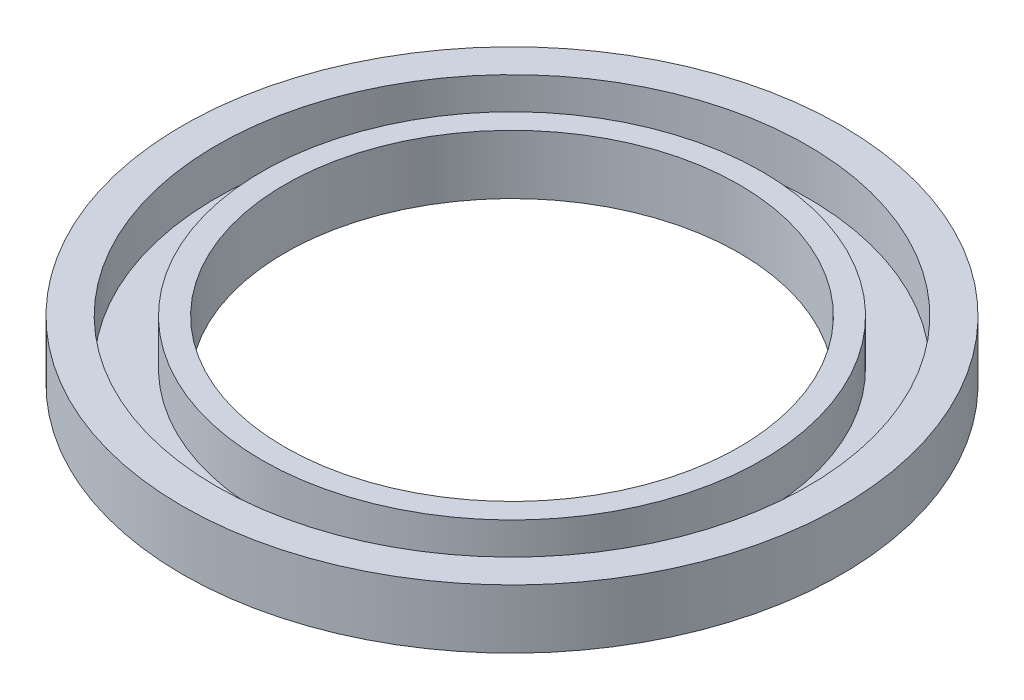
ISO-10303-21;
HEADER;
FILE_DESCRIPTION(('STEP AP214'),'2;1');
FILE_NAME('part.step','',(''),(''),'','','');
FILE_SCHEMA(('AUTOMOTIVE_DESIGN { 1 0 10303 214 1 1 1 1 }'));
ENDSEC;
DATA;
#1=APPLICATION_CONTEXT('core data for automotive mechanical design processes');
#2=APPLICATION_PROTOCOL_DEFINITION('international standard','automotive_design',2000,#1);
#3=PRODUCT_CONTEXT('',#1,'mechanical');
#4=PRODUCT('Part','Part','',(#3));
#5=PRODUCT_RELATED_PRODUCT_CATEGORY('part','',(#4));
#6=PRODUCT_DEFINITION_FORMATION('','',#4);
#7=PRODUCT_DEFINITION_CONTEXT('part definition',#1,'design');
#8=PRODUCT_DEFINITION('design','',#6,#7);
#9=PRODUCT_DEFINITION_SHAPE('','',#8);
#10=(LENGTH_UNIT() NAMED_UNIT(*) SI_UNIT(.MILLI.,.METRE.));
#11=(NAMED_UNIT(*) PLANE_ANGLE_UNIT() SI_UNIT($,.RADIAN.));
#12=(NAMED_UNIT(*) SI_UNIT($,.STERADIAN.) SOLID_ANGLE_UNIT());
#13=UNCERTAINTY_MEASURE_WITH_UNIT(LENGTH_MEASURE(1.E-05),#10,'distance_accuracy_value','');
#14=(GEOMETRIC_REPRESENTATION_CONTEXT(3) GLOBAL_UNCERTAINTY_ASSIGNED_CONTEXT((#13)) GLOBAL_UNIT_ASSIGNED_CONTEXT((#10,
#11,#12)) REPRESENTATION_CONTEXT('',''));
#15=CARTESIAN_POINT('',(0.,0.,0.));
#16=DIRECTION('',(0.,0.,1.));
#17=DIRECTION('',(1.,0.,0.));
#18=AXIS2_PLACEMENT_3D('',#15,#16,#17);
#19=CARTESIAN_POINT('',(0.,13.,0.));
#20=DIRECTION('',(0.,1.,0.));
#21=DIRECTION('',(0.,0.,1.));
#22=AXIS2_PLACEMENT_3D('',#19,#20,#21);
#23=PLANE('',#22);
#24=CARTESIAN_POINT('',(0.,13.,0.));
#25=DIRECTION('',(0.,1.,0.));
#26=DIRECTION('',(0.,0.,1.));
#27=AXIS2_PLACEMENT_3D('',#24,#25,#26);
#28=CIRCLE('',#27,50.);
#29=CARTESIAN_POINT('',(0.,13.,-50.));
#30=VERTEX_POINT('',#29);
#31=EDGE_CURVE('E50',#30,#30,#28,.T.);
#32=ORIENTED_EDGE('',*,*,#31,.F.);
#33=EDGE_LOOP('',(#32));
#34=FACE_BOUND('',#33,.T.);
#35=CARTESIAN_POINT('',(0.,13.,0.));
#36=DIRECTION('',(0.,1.,0.));
#37=DIRECTION('',(0.,0.,1.));
#38=AXIS2_PLACEMENT_3D('',#35,#36,#37);
#39=CIRCLE('',#38,55.);
#40=CARTESIAN_POINT('',(0.,13.,55.));
#41=VERTEX_POINT('',#40);
#42=EDGE_CURVE('E64',#41,#41,#39,.T.);
#43=ORIENTED_EDGE('',*,*,#42,.T.);
#44=EDGE_LOOP('',(#43));
#45=FACE_BOUND('',#44,.T.);
#46=ADVANCED_FACE('F39',(#34,#45),#23,.T.);
#47=CARTESIAN_POINT('',(0.,13.,0.));
#48=DIRECTION('',(0.,1.,0.));
#49=DIRECTION('',(0.,0.,1.));
#50=AXIS2_PLACEMENT_3D('',#47,#48,#49);
#51=CIRCLE('',#50,65.);
#52=CARTESIAN_POINT('',(0.,13.,65.));
#53=VERTEX_POINT('',#52);
#54=EDGE_CURVE('E58',#53,#53,#51,.T.);
#55=ORIENTED_EDGE('',*,*,#54,.F.);
#56=EDGE_LOOP('',(#55));
#57=FACE_BOUND('',#56,.T.);
#58=CARTESIAN_POINT('',(0.,13.,0.));
#59=DIRECTION('',(0.,1.,0.));
#60=DIRECTION('',(0.,0.,1.));
#61=AXIS2_PLACEMENT_3D('',#58,#59,#60);
#62=CIRCLE('',#61,72.5);
#63=CARTESIAN_POINT('',(0.,13.,-72.5));
#64=VERTEX_POINT('',#63);
#65=EDGE_CURVE('E10',#64,#64,#62,.T.);
#66=ORIENTED_EDGE('',*,*,#65,.T.);
#67=EDGE_LOOP('',(#66));
#68=FACE_BOUND('',#67,.T.);
#69=ADVANCED_FACE('F86',(#57,#68),#23,.T.);
#70=CARTESIAN_POINT('',(0.,0.,0.));
#71=DIRECTION('',(0.,1.,0.));
#72=DIRECTION('',(0.,0.,1.));
#73=AXIS2_PLACEMENT_3D('',#70,#71,#72);
#74=PLANE('',#73);
#75=CARTESIAN_POINT('',(0.,0.,0.));
#76=DIRECTION('',(0.,1.,0.));
#77=DIRECTION('',(0.,0.,1.));
#78=AXIS2_PLACEMENT_3D('',#75,#76,#77);
#79=CIRCLE('',#78,72.5);
#80=CARTESIAN_POINT('',(0.,0.,-72.5));
#81=VERTEX_POINT('',#80);
#82=EDGE_CURVE('E43',#81,#81,#79,.T.);
#83=ORIENTED_EDGE('',*,*,#82,.F.);
#84=EDGE_LOOP('',(#83));
#85=FACE_BOUND('',#84,.T.);
#86=CARTESIAN_POINT('',(0.,0.,0.));
#87=DIRECTION('',(0.,1.,0.));
#88=DIRECTION('',(0.,0.,1.));
#89=AXIS2_PLACEMENT_3D('',#86,#87,#88);
#90=CIRCLE('',#89,50.);
#91=CARTESIAN_POINT('',(0.,0.,-50.));
#92=VERTEX_POINT('',#91);
#93=EDGE_CURVE('E52',#92,#92,#90,.T.);
#94=ORIENTED_EDGE('',*,*,#93,.T.);
#95=EDGE_LOOP('',(#94));
#96=FACE_BOUND('',#95,.T.);
#97=ADVANCED_FACE('F88',(#85,#96),#74,.F.);
#98=CARTESIAN_POINT('',(0.,13.,0.));
#99=DIRECTION('',(0.,-1.,0.));
#100=DIRECTION('',(0.,0.,-1.));
#101=AXIS2_PLACEMENT_3D('',#98,#99,#100);
#102=CYLINDRICAL_SURFACE('',#101,72.5);
#103=CARTESIAN_POINT('',(0.,13.,-72.5));
#104=CARTESIAN_POINT('',(0.,12.8645833333333,-72.5));
#105=CARTESIAN_POINT('',(0.,12.7291666666667,-72.5));
#106=CARTESIAN_POINT('',(0.,12.4583333333333,-72.5));
#107=CARTESIAN_POINT('',(0.,12.3229166666667,-72.5));
#108=CARTESIAN_POINT('',(0.,12.0520833333333,-72.5));
#109=CARTESIAN_POINT('',(0.,11.9166666666667,-72.5));
#110=CARTESIAN_POINT('',(0.,11.6458333333333,-72.5));
#111=CARTESIAN_POINT('',(0.,11.5104166666667,-72.5));
#112=CARTESIAN_POINT('',(0.,11.2395833333333,-72.5));
#113=CARTESIAN_POINT('',(0.,11.1041666666667,-72.5));
#114=CARTESIAN_POINT('',(0.,10.8333333333333,-72.5));
#115=CARTESIAN_POINT('',(0.,10.6979166666667,-72.5));
#116=CARTESIAN_POINT('',(0.,10.4270833333333,-72.5));
#117=CARTESIAN_POINT('',(0.,10.2916666666667,-72.5));
#118=CARTESIAN_POINT('',(0.,10.0208333333333,-72.5));
#119=CARTESIAN_POINT('',(0.,9.88541666666667,-72.5));
#120=CARTESIAN_POINT('',(0.,9.61458333333333,-72.5));
#121=CARTESIAN_POINT('',(0.,9.47916666666667,-72.5));
#122=CARTESIAN_POINT('',(0.,9.20833333333333,-72.5));
#123=CARTESIAN_POINT('',(0.,9.07291666666666,-72.5));
#124=CARTESIAN_POINT('',(0.,8.80208333333333,-72.5));
#125=CARTESIAN_POINT('',(0.,8.66666666666667,-72.5));
#126=CARTESIAN_POINT('',(0.,8.39583333333333,-72.5));
#127=CARTESIAN_POINT('',(0.,8.26041666666667,-72.5));
#128=CARTESIAN_POINT('',(0.,7.98958333333333,-72.5));
#129=CARTESIAN_POINT('',(0.,7.85416666666667,-72.5));
#130=CARTESIAN_POINT('',(0.,7.58333333333333,-72.5));
#131=CARTESIAN_POINT('',(0.,7.44791666666667,-72.5));
#132=CARTESIAN_POINT('',(0.,7.17708333333333,-72.5));
#133=CARTESIAN_POINT('',(0.,7.04166666666667,-72.5));
#134=CARTESIAN_POINT('',(0.,6.77083333333333,-72.5));
#135=CARTESIAN_POINT('',(0.,6.63541666666667,-72.5));
#136=CARTESIAN_POINT('',(0.,6.36458333333333,-72.5));
#137=CARTESIAN_POINT('',(0.,6.22916666666667,-72.5));
#138=CARTESIAN_POINT('',(0.,5.95833333333333,-72.5));
#139=CARTESIAN_POINT('',(0.,5.82291666666667,-72.5));
#140=CARTESIAN_POINT('',(0.,5.55208333333333,-72.5));
#141=CARTESIAN_POINT('',(0.,5.41666666666667,-72.5));
#142=CARTESIAN_POINT('',(0.,5.14583333333333,-72.5));
#143=CARTESIAN_POINT('',(0.,5.01041666666667,-72.5));
#144=CARTESIAN_POINT('',(0.,4.73958333333333,-72.5));
#145=CARTESIAN_POINT('',(0.,4.60416666666667,-72.5));
#146=CARTESIAN_POINT('',(0.,4.33333333333333,-72.5));
#147=CARTESIAN_POINT('',(0.,4.19791666666667,-72.5));
#148=CARTESIAN_POINT('',(0.,3.92708333333333,-72.5));
#149=CARTESIAN_POINT('',(0.,3.79166666666667,-72.5));
#150=CARTESIAN_POINT('',(0.,3.52083333333333,-72.5));
#151=CARTESIAN_POINT('',(0.,3.38541666666667,-72.5));
#152=CARTESIAN_POINT('',(0.,3.11458333333333,-72.5));
#153=CARTESIAN_POINT('',(0.,2.97916666666667,-72.5));
#154=CARTESIAN_POINT('',(0.,2.70833333333333,-72.5));
#155=CARTESIAN_POINT('',(0.,2.57291666666667,-72.5));
#156=CARTESIAN_POINT('',(0.,2.30208333333333,-72.5));
#157=CARTESIAN_POINT('',(0.,2.16666666666667,-72.5));
#158=CARTESIAN_POINT('',(0.,1.89583333333333,-72.5));
#159=CARTESIAN_POINT('',(0.,1.76041666666667,-72.5));
#160=CARTESIAN_POINT('',(0.,1.48958333333333,-72.5));
#161=CARTESIAN_POINT('',(0.,1.35416666666667,-72.5));
#162=CARTESIAN_POINT('',(0.,1.08333333333333,-72.5));
#163=CARTESIAN_POINT('',(0.,0.947916666666667,-72.5));
#164=CARTESIAN_POINT('',(0.,0.677083333333334,-72.5));
#165=CARTESIAN_POINT('',(0.,0.541666666666667,-72.5));
#166=CARTESIAN_POINT('',(0.,0.270833333333334,-72.5));
#167=CARTESIAN_POINT('',(0.,0.135416666666667,-72.5));
#168=CARTESIAN_POINT('',(0.,0.,-72.5));
#169=B_SPLINE_CURVE_WITH_KNOTS('',3,(#103,#104,#105,#106,#107,#108,#109,#110,#111,#112,#113,
#114,#115,#116,#117,#118,#119,#120,#121,#122,#123,#124,#125,#126,#127,#128,#129,#130,#131,#132,
#133,#134,#135,#136,#137,#138,#139,#140,#141,#142,#143,#144,#145,#146,#147,#148,#149,#150,#151,
#152,#153,#154,#155,#156,#157,#158,#159,#160,#161,#162,#163,#164,#165,#166,#167,#168),
.UNSPECIFIED.,.F.,.F.,(4,2,2,2,2,2,2,2,2,2,2,2,2,2,2,2,2,2,2,2,2,2,2,2,2,2,2,2,2,2,2,2,4),(0.,
0.40625,0.812500000000001,1.21875,1.625,2.03125,2.4375,2.84375,3.25,3.65625,4.0625,4.46875,
4.875,5.28125,5.6875,6.09375,6.5,6.90625,7.3125,7.71875,8.125,8.53125,8.9375,9.34375,9.75,
10.15625,10.5625,10.96875,11.375,11.78125,12.1875,12.59375,13.),.UNSPECIFIED.);
#170=EDGE_CURVE('BSEAM41',#64,#81,#169,.T.);
#171=ORIENTED_EDGE('',*,*,#65,.F.);
#172=ORIENTED_EDGE('',*,*,#82,.T.);
#173=ORIENTED_EDGE('',*,*,#170,.T.);
#174=ORIENTED_EDGE('',*,*,#170,.F.);
#175=EDGE_LOOP('',(#171,#173,#172,#174));
#176=FACE_BOUND('',#175,.T.);
#177=ADVANCED_FACE('F41',(#176),#102,.T.);
#178=CARTESIAN_POINT('',(0.,13.,0.));
#179=DIRECTION('',(0.,-1.,0.));
#180=DIRECTION('',(0.,0.,-1.));
#181=AXIS2_PLACEMENT_3D('',#178,#179,#180);
#182=CYLINDRICAL_SURFACE('',#181,50.);
#183=CARTESIAN_POINT('',(0.,13.,-50.));
#184=CARTESIAN_POINT('',(0.,12.8645833333333,-50.));
#185=CARTESIAN_POINT('',(0.,12.7291666666667,-50.));
#186=CARTESIAN_POINT('',(0.,12.4583333333333,-50.));
#187=CARTESIAN_POINT('',(0.,12.3229166666667,-50.));
#188=CARTESIAN_POINT('',(0.,12.0520833333333,-50.));
#189=CARTESIAN_POINT('',(0.,11.9166666666667,-50.));
#190=CARTESIAN_POINT('',(0.,11.6458333333333,-50.));
#191=CARTESIAN_POINT('',(0.,11.5104166666667,-50.));
#192=CARTESIAN_POINT('',(0.,11.2395833333333,-50.));
#193=CARTESIAN_POINT('',(0.,11.1041666666667,-50.));
#194=CARTESIAN_POINT('',(0.,10.8333333333333,-50.));
#195=CARTESIAN_POINT('',(0.,10.6979166666667,-50.));
#196=CARTESIAN_POINT('',(0.,10.4270833333333,-50.));
#197=CARTESIAN_POINT('',(0.,10.2916666666667,-50.));
#198=CARTESIAN_POINT('',(0.,10.0208333333333,-50.));
#199=CARTESIAN_POINT('',(0.,9.88541666666667,-50.));
#200=CARTESIAN_POINT('',(0.,9.61458333333333,-50.));
#201=CARTESIAN_POINT('',(0.,9.47916666666667,-50.));
#202=CARTESIAN_POINT('',(0.,9.20833333333333,-50.));
#203=CARTESIAN_POINT('',(0.,9.07291666666666,-50.));
#204=CARTESIAN_POINT('',(0.,8.80208333333333,-50.));
#205=CARTESIAN_POINT('',(0.,8.66666666666667,-50.));
#206=CARTESIAN_POINT('',(0.,8.39583333333333,-50.));
#207=CARTESIAN_POINT('',(0.,8.26041666666667,-50.));
#208=CARTESIAN_POINT('',(0.,7.98958333333333,-50.));
#209=CARTESIAN_POINT('',(0.,7.85416666666667,-50.));
#210=CARTESIAN_POINT('',(0.,7.58333333333333,-50.));
#211=CARTESIAN_POINT('',(0.,7.44791666666667,-50.));
#212=CARTESIAN_POINT('',(0.,7.17708333333333,-50.));
#213=CARTESIAN_POINT('',(0.,7.04166666666667,-50.));
#214=CARTESIAN_POINT('',(0.,6.77083333333333,-50.));
#215=CARTESIAN_POINT('',(0.,6.63541666666667,-50.));
#216=CARTESIAN_POINT('',(0.,6.36458333333333,-50.));
#217=CARTESIAN_POINT('',(0.,6.22916666666667,-50.));
#218=CARTESIAN_POINT('',(0.,5.95833333333333,-50.));
#219=CARTESIAN_POINT('',(0.,5.82291666666667,-50.));
#220=CARTESIAN_POINT('',(0.,5.55208333333333,-50.));
#221=CARTESIAN_POINT('',(0.,5.41666666666667,-50.));
#222=CARTESIAN_POINT('',(0.,5.14583333333333,-50.));
#223=CARTESIAN_POINT('',(0.,5.01041666666667,-50.));
#224=CARTESIAN_POINT('',(0.,4.73958333333333,-50.));
#225=CARTESIAN_POINT('',(0.,4.60416666666667,-50.));
#226=CARTESIAN_POINT('',(0.,4.33333333333333,-50.));
#227=CARTESIAN_POINT('',(0.,4.19791666666667,-50.));
#228=CARTESIAN_POINT('',(0.,3.92708333333333,-50.));
#229=CARTESIAN_POINT('',(0.,3.79166666666667,-50.));
#230=CARTESIAN_POINT('',(0.,3.52083333333333,-50.));
#231=CARTESIAN_POINT('',(0.,3.38541666666667,-50.));
#232=CARTESIAN_POINT('',(0.,3.11458333333333,-50.));
#233=CARTESIAN_POINT('',(0.,2.97916666666667,-50.));
#234=CARTESIAN_POINT('',(0.,2.70833333333333,-50.));
#235=CARTESIAN_POINT('',(0.,2.57291666666667,-50.));
#236=CARTESIAN_POINT('',(0.,2.30208333333333,-50.));
#237=CARTESIAN_POINT('',(0.,2.16666666666667,-50.));
#238=CARTESIAN_POINT('',(0.,1.89583333333333,-50.));
#239=CARTESIAN_POINT('',(0.,1.76041666666667,-50.));
#240=CARTESIAN_POINT('',(0.,1.48958333333333,-50.));
#241=CARTESIAN_POINT('',(0.,1.35416666666667,-50.));
#242=CARTESIAN_POINT('',(0.,1.08333333333333,-50.));
#243=CARTESIAN_POINT('',(0.,0.947916666666667,-50.));
#244=CARTESIAN_POINT('',(0.,0.677083333333334,-50.));
#245=CARTESIAN_POINT('',(0.,0.541666666666667,-50.));
#246=CARTESIAN_POINT('',(0.,0.270833333333334,-50.));
#247=CARTESIAN_POINT('',(0.,0.135416666666667,-50.));
#248=CARTESIAN_POINT('',(0.,0.,-50.));
#249=B_SPLINE_CURVE_WITH_KNOTS('',3,(#183,#184,#185,#186,#187,#188,#189,#190,#191,#192,#193,
#194,#195,#196,#197,#198,#199,#200,#201,#202,#203,#204,#205,#206,#207,#208,#209,#210,#211,#212,
#213,#214,#215,#216,#217,#218,#219,#220,#221,#222,#223,#224,#225,#226,#227,#228,#229,#230,#231,
#232,#233,#234,#235,#236,#237,#238,#239,#240,#241,#242,#243,#244,#245,#246,#247,#248),
.UNSPECIFIED.,.F.,.F.,(4,2,2,2,2,2,2,2,2,2,2,2,2,2,2,2,2,2,2,2,2,2,2,2,2,2,2,2,2,2,2,2,4),(0.,
0.40625,0.812500000000001,1.21875,1.625,2.03125,2.4375,2.84375,3.25,3.65625,4.0625,4.46875,
4.875,5.28125,5.6875,6.09375,6.5,6.90625,7.3125,7.71875,8.125,8.53125,8.9375,9.34375,9.75,
10.15625,10.5625,10.96875,11.375,11.78125,12.1875,12.59375,13.),.UNSPECIFIED.);
#250=EDGE_CURVE('BSEAM82',#30,#92,#249,.T.);
#251=ORIENTED_EDGE('',*,*,#31,.T.);
#252=ORIENTED_EDGE('',*,*,#93,.F.);
#253=ORIENTED_EDGE('',*,*,#250,.T.);
#254=ORIENTED_EDGE('',*,*,#250,.F.);
#255=EDGE_LOOP('',(#251,#253,#252,#254));
#256=FACE_BOUND('',#255,.T.);
#257=ADVANCED_FACE('F82',(#256),#182,.F.);
#258=CARTESIAN_POINT('',(0.,3.,0.));
#259=DIRECTION('',(0.,1.,0.));
#260=DIRECTION('',(0.,0.,1.));
#261=AXIS2_PLACEMENT_3D('',#258,#259,#260);
#262=CYLINDRICAL_SURFACE('',#261,65.);
#263=CARTESIAN_POINT('',(0.,3.,0.));
#264=DIRECTION('',(0.,1.,0.));
#265=DIRECTION('',(0.,0.,1.));
#266=AXIS2_PLACEMENT_3D('',#263,#264,#265);
#267=CIRCLE('',#266,65.);
#268=CARTESIAN_POINT('',(0.,3.,65.));
#269=VERTEX_POINT('',#268);
#270=EDGE_CURVE('E55',#269,#269,#267,.T.);
#271=ORIENTED_EDGE('',*,*,#270,.F.);
#272=EDGE_LOOP('',(#271));
#273=FACE_BOUND('',#272,.T.);
#274=ORIENTED_EDGE('',*,*,#54,.T.);
#275=EDGE_LOOP('',(#274));
#276=FACE_BOUND('',#275,.T.);
#277=ADVANCED_FACE('F76',(#273,#276),#262,.F.);
#278=CARTESIAN_POINT('',(0.,3.,0.));
#279=DIRECTION('',(0.,1.,0.));
#280=DIRECTION('',(0.,0.,1.));
#281=AXIS2_PLACEMENT_3D('',#278,#279,#280);
#282=PLANE('',#281);
#283=CARTESIAN_POINT('',(0.,3.,0.));
#284=DIRECTION('',(0.,1.,0.));
#285=DIRECTION('',(0.,0.,1.));
#286=AXIS2_PLACEMENT_3D('',#283,#284,#285);
#287=CIRCLE('',#286,55.);
#288=CARTESIAN_POINT('',(0.,3.,55.));
#289=VERTEX_POINT('',#288);
#290=EDGE_CURVE('E61',#289,#289,#287,.T.);
#291=ORIENTED_EDGE('',*,*,#290,.F.);
#292=EDGE_LOOP('',(#291));
#293=FACE_BOUND('',#292,.T.);
#294=ORIENTED_EDGE('',*,*,#270,.T.);
#295=EDGE_LOOP('',(#294));
#296=FACE_BOUND('',#295,.T.);
#297=ADVANCED_FACE('F73',(#293,#296),#282,.T.);
#298=CARTESIAN_POINT('',(0.,3.,0.));
#299=DIRECTION('',(0.,1.,0.));
#300=DIRECTION('',(0.,0.,1.));
#301=AXIS2_PLACEMENT_3D('',#298,#299,#300);
#302=CYLINDRICAL_SURFACE('',#301,55.);
#303=ORIENTED_EDGE('',*,*,#290,.T.);
#304=EDGE_LOOP('',(#303));
#305=FACE_BOUND('',#304,.T.);
#306=ORIENTED_EDGE('',*,*,#42,.F.);
#307=EDGE_LOOP('',(#306));
#308=FACE_BOUND('',#307,.T.);
#309=ADVANCED_FACE('F70',(#305,#308),#302,.T.);
#310=CLOSED_SHELL('',(#46,#69,#97,#177,#257,#277,#297,#309));
#311=MANIFOLD_SOLID_BREP('B2',#310);
#312=ADVANCED_BREP_SHAPE_REPRESENTATION('',(#18,#311),#14);
#313=SHAPE_DEFINITION_REPRESENTATION(#9,#312);
ENDSEC;
END-ISO-10303-21;
